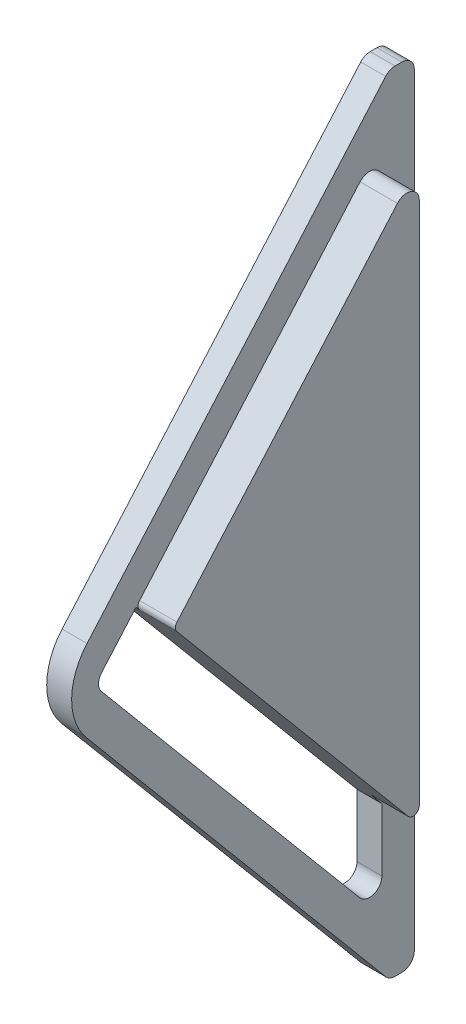
ISO-10303-21;
HEADER;
FILE_DESCRIPTION(('STEP AP214'),'2;1');
FILE_NAME('part.step','',(''),(''),'','','');
FILE_SCHEMA(('AUTOMOTIVE_DESIGN { 1 0 10303 214 1 1 1 1 }'));
ENDSEC;
DATA;
#1=APPLICATION_CONTEXT('core data for automotive mechanical design processes');
#2=APPLICATION_PROTOCOL_DEFINITION('international standard','automotive_design',2000,#1);
#3=PRODUCT_CONTEXT('',#1,'mechanical');
#4=PRODUCT('Part','Part','',(#3));
#5=PRODUCT_RELATED_PRODUCT_CATEGORY('part','',(#4));
#6=PRODUCT_DEFINITION_FORMATION('','',#4);
#7=PRODUCT_DEFINITION_CONTEXT('part definition',#1,'design');
#8=PRODUCT_DEFINITION('design','',#6,#7);
#9=PRODUCT_DEFINITION_SHAPE('','',#8);
#10=(LENGTH_UNIT() NAMED_UNIT(*) SI_UNIT(.MILLI.,.METRE.));
#11=(NAMED_UNIT(*) PLANE_ANGLE_UNIT() SI_UNIT($,.RADIAN.));
#12=(NAMED_UNIT(*) SI_UNIT($,.STERADIAN.) SOLID_ANGLE_UNIT());
#13=UNCERTAINTY_MEASURE_WITH_UNIT(LENGTH_MEASURE(1.E-05),#10,'distance_accuracy_value','');
#14=(GEOMETRIC_REPRESENTATION_CONTEXT(3) GLOBAL_UNCERTAINTY_ASSIGNED_CONTEXT((#13)) GLOBAL_UNIT_ASSIGNED_CONTEXT((#10,
#11,#12)) REPRESENTATION_CONTEXT('',''));
#15=CARTESIAN_POINT('',(0.,0.,0.));
#16=DIRECTION('',(0.,0.,1.));
#17=DIRECTION('',(1.,0.,0.));
#18=AXIS2_PLACEMENT_3D('',#15,#16,#17);
#19=CARTESIAN_POINT('',(15.819939298706,22.7196326731635,20.4241240625662));
#20=DIRECTION('',(0.,0.657969745780061,0.753044363658691));
#21=DIRECTION('',(0.,-0.753044363658691,0.657969745780061));
#22=AXIS2_PLACEMENT_3D('',#19,#20,#21);
#23=PLANE('',#22);
#24=DIRECTION('',(0.,0.753044363658691,-0.657969745780061));
#25=VECTOR('',#24,1.);
#26=CARTESIAN_POINT('',(17.819939298706,22.7196326731635,20.4241240625662));
#27=LINE('',#26,#25);
#28=CARTESIAN_POINT('',(17.819939298706,33.4137483442441,11.0801797891415));
#29=VERTEX_POINT('',#28);
#30=CARTESIAN_POINT('',(17.819939298706,53.6703099449129,-6.61891647925724));
#31=VERTEX_POINT('',#30);
#32=EDGE_CURVE('E280',#29,#31,#27,.T.);
#33=ORIENTED_EDGE('',*,*,#32,.F.);
#34=DIRECTION('',(-1.,0.,0.));
#35=VECTOR('',#34,1.);
#36=CARTESIAN_POINT('',(20.819939298706,33.4137483442441,11.0801797891415));
#37=LINE('',#36,#35);
#38=CARTESIAN_POINT('',(20.819939298706,33.4137483442441,11.0801797891415));
#39=VERTEX_POINT('',#38);
#40=EDGE_CURVE('E415',#29,#39,#37,.F.);
#41=ORIENTED_EDGE('',*,*,#40,.T.);
#42=DIRECTION('',(0.,-0.753044363658691,0.657969745780061));
#43=VECTOR('',#42,1.);
#44=CARTESIAN_POINT('',(20.819939298706,22.7196326731635,20.4241240625662));
#45=LINE('',#44,#43);
#46=CARTESIAN_POINT('',(20.819939298706,53.6703099449129,-6.61891647925724));
#47=VERTEX_POINT('',#46);
#48=EDGE_CURVE('E307',#47,#39,#45,.T.);
#49=ORIENTED_EDGE('',*,*,#48,.F.);
#50=DIRECTION('',(1.,0.,0.));
#51=VECTOR('',#50,1.);
#52=CARTESIAN_POINT('',(15.819939298706,53.6703099449129,-6.61891647925724));
#53=LINE('',#52,#51);
#54=EDGE_CURVE('E337',#47,#31,#53,.F.);
#55=ORIENTED_EDGE('',*,*,#54,.T.);
#56=EDGE_LOOP('',(#33,#41,#49,#55));
#57=FACE_BOUND('',#56,.T.);
#58=ADVANCED_FACE('F47',(#57),#23,.T.);
#59=CARTESIAN_POINT('',(15.819939298706,-2.9650885007879,-8.37196084291593));
#60=DIRECTION('',(0.,0.,-1.));
#61=DIRECTION('',(-1.,0.,0.));
#62=AXIS2_PLACEMENT_3D('',#59,#60,#61);
#63=PLANE('',#62);
#64=DIRECTION('',(0.,1.,0.));
#65=VECTOR('',#64,1.);
#66=CARTESIAN_POINT('',(20.819939298706,-2.9650885007879,-8.37196084291593));
#67=LINE('',#66,#65);
#68=CARTESIAN_POINT('',(20.819939298706,10.9472034486352,-8.37196084291593));
#69=VERTEX_POINT('',#68);
#70=CARTESIAN_POINT('',(20.819939298706,53.0123401991329,-8.37196084291593));
#71=VERTEX_POINT('',#70);
#72=EDGE_CURVE('E304',#69,#71,#67,.T.);
#73=ORIENTED_EDGE('',*,*,#72,.F.);
#74=DIRECTION('',(-1.,0.,0.));
#75=VECTOR('',#74,1.);
#76=CARTESIAN_POINT('',(17.819939298706,10.9472034486352,-8.37196084291593));
#77=LINE('',#76,#75);
#78=CARTESIAN_POINT('',(17.819939298706,10.9472034486352,-8.37196084291593));
#79=VERTEX_POINT('',#78);
#80=EDGE_CURVE('E424',#69,#79,#77,.T.);
#81=ORIENTED_EDGE('',*,*,#80,.T.);
#82=DIRECTION('',(0.,-1.,0.));
#83=VECTOR('',#82,1.);
#84=CARTESIAN_POINT('',(17.819939298706,-2.9650885007879,-8.37196084291593));
#85=LINE('',#84,#83);
#86=CARTESIAN_POINT('',(17.819939298706,53.0123401991329,-8.37196084291593));
#87=VERTEX_POINT('',#86);
#88=EDGE_CURVE('E311',#87,#79,#85,.T.);
#89=ORIENTED_EDGE('',*,*,#88,.F.);
#90=DIRECTION('',(1.,0.,0.));
#91=VECTOR('',#90,1.);
#92=CARTESIAN_POINT('',(15.819939298706,53.0123401991329,-8.37196084291593));
#93=LINE('',#92,#91);
#94=EDGE_CURVE('E333',#87,#71,#93,.T.);
#95=ORIENTED_EDGE('',*,*,#94,.T.);
#96=EDGE_LOOP('',(#73,#81,#89,#95));
#97=FACE_BOUND('',#96,.T.);
#98=ADVANCED_FACE('F463',(#97),#63,.T.);
#99=CARTESIAN_POINT('',(20.819939298706,-2.9650885007879,-8.97196084291592));
#100=DIRECTION('',(1.,0.,0.));
#101=DIRECTION('',(0.,0.,-1.));
#102=AXIS2_PLACEMENT_3D('',#99,#100,#101);
#103=PLANE('',#102);
#104=ORIENTED_EDGE('',*,*,#48,.T.);
#105=CARTESIAN_POINT('',(20.819939298706,33.084763471354,10.7036576073121));
#106=DIRECTION('',(1.,0.,0.));
#107=DIRECTION('',(0.,0.,-1.));
#108=AXIS2_PLACEMENT_3D('',#105,#106,#107);
#109=CIRCLE('',#108,0.5);
#110=CARTESIAN_POINT('',(20.819939298706,32.7633696665108,11.0866798288716));
#111=VERTEX_POINT('',#110);
#112=EDGE_CURVE('E421',#39,#111,#109,.T.);
#113=ORIENTED_EDGE('',*,*,#112,.T.);
#114=DIRECTION('',(0.,-0.766044443118982,-0.642787609686535));
#115=VECTOR('',#114,1.);
#116=CARTESIAN_POINT('',(20.819939298706,8.07791098952799,-9.62687944242635));
#117=LINE('',#116,#115);
#118=CARTESIAN_POINT('',(20.819939298706,10.6258096437919,-7.48893862135644));
#119=VERTEX_POINT('',#118);
#120=EDGE_CURVE('E241',#111,#119,#117,.T.);
#121=ORIENTED_EDGE('',*,*,#120,.T.);
#122=CARTESIAN_POINT('',(20.819939298706,10.9472034486352,-7.87196084291593));
#123=DIRECTION('',(1.,0.,0.));
#124=DIRECTION('',(0.,0.,-1.));
#125=AXIS2_PLACEMENT_3D('',#122,#123,#124);
#126=CIRCLE('',#125,0.5);
#127=EDGE_CURVE('E418',#119,#69,#126,.T.);
#128=ORIENTED_EDGE('',*,*,#127,.T.);
#129=ORIENTED_EDGE('',*,*,#72,.T.);
#130=CARTESIAN_POINT('',(20.819939298706,53.0123401991329,-7.37196084291593));
#131=DIRECTION('',(1.,0.,0.));
#132=DIRECTION('',(0.,0.,-1.));
#133=AXIS2_PLACEMENT_3D('',#130,#131,#132);
#134=CIRCLE('',#133,1.);
#135=EDGE_CURVE('E330',#71,#47,#134,.T.);
#136=ORIENTED_EDGE('',*,*,#135,.T.);
#137=EDGE_LOOP('',(#104,#113,#121,#128,#129,#136));
#138=FACE_BOUND('',#137,.T.);
#139=ADVANCED_FACE('F444',(#138),#103,.T.);
#140=CARTESIAN_POINT('',(17.819939298706,60.3149114992121,-8.97196084291592));
#141=DIRECTION('',(0.,1.,0.));
#142=DIRECTION('',(0.,0.,1.));
#143=AXIS2_PLACEMENT_3D('',#140,#141,#142);
#144=PLANE('',#143);
#145=DIRECTION('',(0.,0.,-1.));
#146=VECTOR('',#145,1.);
#147=CARTESIAN_POINT('',(15.819939298706,60.3149114992121,-8.97196084291592));
#148=LINE('',#147,#146);
#149=CARTESIAN_POINT('',(15.819939298706,60.3149114992121,-9.42615752869706));
#150=VERTEX_POINT('',#149);
#151=CARTESIAN_POINT('',(15.819939298706,60.3149114992121,-9.97196084291593));
#152=VERTEX_POINT('',#151);
#153=EDGE_CURVE('E259',#150,#152,#148,.T.);
#154=ORIENTED_EDGE('',*,*,#153,.F.);
#155=DIRECTION('',(-1.,0.,0.));
#156=VECTOR('',#155,1.);
#157=CARTESIAN_POINT('',(17.819939298706,60.3149114992121,-9.42615752869706));
#158=LINE('',#157,#156);
#159=CARTESIAN_POINT('',(17.819939298706,60.3149114992121,-9.42615752869706));
#160=VERTEX_POINT('',#159);
#161=EDGE_CURVE('E400',#150,#160,#158,.F.);
#162=ORIENTED_EDGE('',*,*,#161,.T.);
#163=DIRECTION('',(0.,0.,-1.));
#164=VECTOR('',#163,1.);
#165=CARTESIAN_POINT('',(17.819939298706,60.3149114992121,-8.97196084291592));
#166=LINE('',#165,#164);
#167=CARTESIAN_POINT('',(17.819939298706,60.3149114992121,-9.97196084291593));
#168=VERTEX_POINT('',#167);
#169=EDGE_CURVE('E260',#160,#168,#166,.T.);
#170=ORIENTED_EDGE('',*,*,#169,.T.);
#171=DIRECTION('',(-1.,0.,0.));
#172=VECTOR('',#171,1.);
#173=CARTESIAN_POINT('',(15.819939298706,60.3149114992121,-9.97196084291593));
#174=LINE('',#173,#172);
#175=EDGE_CURVE('E396',#168,#152,#174,.T.);
#176=ORIENTED_EDGE('',*,*,#175,.T.);
#177=EDGE_LOOP('',(#154,#162,#170,#176));
#178=FACE_BOUND('',#177,.T.);
#179=ADVANCED_FACE('F491',(#178),#144,.T.);
#180=CARTESIAN_POINT('',(17.819939298706,24.4303540121917,22.3820394080788));
#181=DIRECTION('',(0.,-0.657969745780061,-0.753044363658691));
#182=DIRECTION('',(0.,0.753044363658691,-0.657969745780061));
#183=AXIS2_PLACEMENT_3D('',#180,#181,#182);
#184=PLANE('',#183);
#185=DIRECTION('',(0.,-0.753044363658691,0.657969745780061));
#186=VECTOR('',#185,1.);
#187=CARTESIAN_POINT('',(17.819939298706,24.4303540121917,22.3820394080788));
#188=LINE('',#187,#186);
#189=CARTESIAN_POINT('',(17.819939298706,59.9728812449922,-8.67311316503838));
#190=VERTEX_POINT('',#189);
#191=CARTESIAN_POINT('',(17.819939298706,32.5389757891054,15.2971609246105));
#192=VERTEX_POINT('',#191);
#193=EDGE_CURVE('E277',#190,#192,#188,.T.);
#194=ORIENTED_EDGE('',*,*,#193,.F.);
#195=DIRECTION('',(-1.,0.,0.));
#196=VECTOR('',#195,1.);
#197=CARTESIAN_POINT('',(15.819939298706,59.9728812449922,-8.67311316503837));
#198=LINE('',#197,#196);
#199=CARTESIAN_POINT('',(15.819939298706,59.9728812449922,-8.67311316503838));
#200=VERTEX_POINT('',#199);
#201=EDGE_CURVE('E392',#190,#200,#198,.T.);
#202=ORIENTED_EDGE('',*,*,#201,.T.);
#203=DIRECTION('',(0.,-0.753044363658691,0.657969745780061));
#204=VECTOR('',#203,1.);
#205=CARTESIAN_POINT('',(15.819939298706,24.4303540121917,22.3820394080788));
#206=LINE('',#205,#204);
#207=CARTESIAN_POINT('',(15.819939298706,32.5389757891054,15.2971609246105));
#208=VERTEX_POINT('',#207);
#209=EDGE_CURVE('E265',#200,#208,#206,.T.);
#210=ORIENTED_EDGE('',*,*,#209,.T.);
#211=DIRECTION('',(-1.,0.,0.));
#212=VECTOR('',#211,1.);
#213=CARTESIAN_POINT('',(17.819939298706,32.5389757891054,15.2971609246105));
#214=LINE('',#213,#212);
#215=EDGE_CURVE('E323',#208,#192,#214,.F.);
#216=ORIENTED_EDGE('',*,*,#215,.T.);
#217=EDGE_LOOP('',(#194,#202,#210,#216));
#218=FACE_BOUND('',#217,.T.);
#219=ADVANCED_FACE('F496',(#218),#184,.F.);
#220=CARTESIAN_POINT('',(17.819939298706,-2.9650885007879,-8.97196084291592));
#221=DIRECTION('',(0.,0.642787609686535,-0.766044443118982));
#222=DIRECTION('',(0.,0.766044443118982,0.642787609686535));
#223=AXIS2_PLACEMENT_3D('',#220,#221,#222);
#224=PLANE('',#223);
#225=DIRECTION('',(0.,-0.766044443118982,-0.642787609686535));
#226=VECTOR('',#225,1.);
#227=CARTESIAN_POINT('',(15.819939298706,-2.9650885007879,-8.97196084291592));
#228=LINE('',#227,#226);
#229=CARTESIAN_POINT('',(15.819939298706,26.0351890117724,15.3621613219119));
#230=VERTEX_POINT('',#229);
#231=CARTESIAN_POINT('',(15.819939298706,-2.60787611047445,-8.67222405795195));
#232=VERTEX_POINT('',#231);
#233=EDGE_CURVE('E292',#230,#232,#228,.T.);
#234=ORIENTED_EDGE('',*,*,#233,.T.);
#235=DIRECTION('',(-1.,0.,0.));
#236=VECTOR('',#235,1.);
#237=CARTESIAN_POINT('',(17.819939298706,-2.60787611047445,-8.67222405795195));
#238=LINE('',#237,#236);
#239=CARTESIAN_POINT('',(17.819939298706,-2.60787611047445,-8.67222405795195));
#240=VERTEX_POINT('',#239);
#241=EDGE_CURVE('E370',#232,#240,#238,.F.);
#242=ORIENTED_EDGE('',*,*,#241,.T.);
#243=DIRECTION('',(0.,-0.766044443118982,-0.642787609686535));
#244=VECTOR('',#243,1.);
#245=CARTESIAN_POINT('',(17.819939298706,-2.9650885007879,-8.97196084291592));
#246=LINE('',#245,#244);
#247=CARTESIAN_POINT('',(17.819939298706,26.0351890117724,15.3621613219119));
#248=VERTEX_POINT('',#247);
#249=EDGE_CURVE('E273',#248,#240,#246,.T.);
#250=ORIENTED_EDGE('',*,*,#249,.F.);
#251=DIRECTION('',(-1.,0.,0.));
#252=VECTOR('',#251,1.);
#253=CARTESIAN_POINT('',(17.819939298706,26.0351890117724,15.3621613219119));
#254=LINE('',#253,#252);
#255=EDGE_CURVE('E315',#248,#230,#254,.T.);
#256=ORIENTED_EDGE('',*,*,#255,.T.);
#257=EDGE_LOOP('',(#234,#242,#250,#256));
#258=FACE_BOUND('',#257,.T.);
#259=ADVANCED_FACE('F505',(#258),#224,.F.);
#260=CARTESIAN_POINT('',(17.819939298706,-2.96508850078792,-8.97196084291592));
#261=DIRECTION('',(0.,1.,0.));
#262=DIRECTION('',(0.,0.,1.));
#263=AXIS2_PLACEMENT_3D('',#260,#261,#262);
#264=PLANE('',#263);
#265=DIRECTION('',(0.,0.,-1.));
#266=VECTOR('',#265,1.);
#267=CARTESIAN_POINT('',(17.819939298706,-2.96508850078792,-8.97196084291592));
#268=LINE('',#267,#266);
#269=CARTESIAN_POINT('',(17.819939298706,-2.96508850078791,-9.43826850107094));
#270=VERTEX_POINT('',#269);
#271=CARTESIAN_POINT('',(17.819939298706,-2.96508850078791,-9.97196084291593));
#272=VERTEX_POINT('',#271);
#273=EDGE_CURVE('E269',#270,#272,#268,.T.);
#274=ORIENTED_EDGE('',*,*,#273,.F.);
#275=DIRECTION('',(-1.,0.,0.));
#276=VECTOR('',#275,1.);
#277=CARTESIAN_POINT('',(17.819939298706,-2.96508850078791,-9.43826850107094));
#278=LINE('',#277,#276);
#279=CARTESIAN_POINT('',(15.819939298706,-2.96508850078791,-9.43826850107094));
#280=VERTEX_POINT('',#279);
#281=EDGE_CURVE('E354',#270,#280,#278,.T.);
#282=ORIENTED_EDGE('',*,*,#281,.T.);
#283=DIRECTION('',(0.,0.,-1.));
#284=VECTOR('',#283,1.);
#285=CARTESIAN_POINT('',(15.819939298706,-2.96508850078792,-8.97196084291592));
#286=LINE('',#285,#284);
#287=CARTESIAN_POINT('',(15.819939298706,-2.96508850078791,-9.97196084291593));
#288=VERTEX_POINT('',#287);
#289=EDGE_CURVE('E288',#280,#288,#286,.T.);
#290=ORIENTED_EDGE('',*,*,#289,.T.);
#291=DIRECTION('',(-1.,0.,0.));
#292=VECTOR('',#291,1.);
#293=CARTESIAN_POINT('',(17.819939298706,-2.96508850078791,-9.97196084291593));
#294=LINE('',#293,#292);
#295=EDGE_CURVE('E351',#288,#272,#294,.F.);
#296=ORIENTED_EDGE('',*,*,#295,.T.);
#297=EDGE_LOOP('',(#274,#282,#290,#296));
#298=FACE_BOUND('',#297,.T.);
#299=ADVANCED_FACE('F501',(#298),#264,.F.);
#300=CARTESIAN_POINT('',(17.819939298706,-2.9650885007879,-10.9719608429159));
#301=DIRECTION('',(0.,0.,1.));
#302=DIRECTION('',(1.,0.,0.));
#303=AXIS2_PLACEMENT_3D('',#300,#301,#302);
#304=PLANE('',#303);
#305=DIRECTION('',(0.,1.,0.));
#306=VECTOR('',#305,1.);
#307=CARTESIAN_POINT('',(17.819939298706,-2.9650885007879,-10.9719608429159));
#308=LINE('',#307,#306);
#309=CARTESIAN_POINT('',(17.819939298706,-1.96508850078791,-10.9719608429159));
#310=VERTEX_POINT('',#309);
#311=CARTESIAN_POINT('',(17.819939298706,59.3149114992121,-10.9719608429159));
#312=VERTEX_POINT('',#311);
#313=EDGE_CURVE('E264',#310,#312,#308,.T.);
#314=ORIENTED_EDGE('',*,*,#313,.F.);
#315=DIRECTION('',(-1.,0.,0.));
#316=VECTOR('',#315,1.);
#317=CARTESIAN_POINT('',(17.819939298706,-1.96508850078791,-10.9719608429159));
#318=LINE('',#317,#316);
#319=CARTESIAN_POINT('',(15.819939298706,-1.96508850078791,-10.9719608429159));
#320=VERTEX_POINT('',#319);
#321=EDGE_CURVE('E388',#310,#320,#318,.T.);
#322=ORIENTED_EDGE('',*,*,#321,.T.);
#323=DIRECTION('',(0.,1.,0.));
#324=VECTOR('',#323,1.);
#325=CARTESIAN_POINT('',(15.819939298706,-2.9650885007879,-10.9719608429159));
#326=LINE('',#325,#324);
#327=CARTESIAN_POINT('',(15.819939298706,59.3149114992121,-10.9719608429159));
#328=VERTEX_POINT('',#327);
#329=EDGE_CURVE('E284',#320,#328,#326,.T.);
#330=ORIENTED_EDGE('',*,*,#329,.T.);
#331=DIRECTION('',(-1.,0.,0.));
#332=VECTOR('',#331,1.);
#333=CARTESIAN_POINT('',(17.819939298706,59.3149114992121,-10.9719608429159));
#334=LINE('',#333,#332);
#335=EDGE_CURVE('E385',#328,#312,#334,.F.);
#336=ORIENTED_EDGE('',*,*,#335,.T.);
#337=EDGE_LOOP('',(#314,#322,#330,#336));
#338=FACE_BOUND('',#337,.T.);
#339=ADVANCED_FACE('F498',(#338),#304,.F.);
#340=CARTESIAN_POINT('',(17.819939298706,-2.9650885007879,-8.97196084291592));
#341=DIRECTION('',(1.,0.,0.));
#342=DIRECTION('',(0.,0.,-1.));
#343=AXIS2_PLACEMENT_3D('',#340,#341,#342);
#344=PLANE('',#343);
#345=CARTESIAN_POINT('',(17.819939298706,29.9255164489071,14.1280095906231));
#346=VERTEX_POINT('',#345);
#347=CARTESIAN_POINT('',(17.819939298706,33.0913419152547,11.3618812218291));
#348=VERTEX_POINT('',#347);
#349=EDGE_CURVE('E205',#346,#348,#27,.T.);
#350=ORIENTED_EDGE('',*,*,#349,.T.);
#351=DIRECTION('',(0.,0.766044443118982,0.642787609686535));
#352=VECTOR('',#351,1.);
#353=CARTESIAN_POINT('',(17.819939298706,1.92009733282976,-14.7938986106202));
#354=LINE('',#353,#352);
#355=CARTESIAN_POINT('',(17.819939298706,32.7633696665108,11.0866798288716));
#356=VERTEX_POINT('',#355);
#357=EDGE_CURVE('E408',#356,#348,#354,.T.);
#358=ORIENTED_EDGE('',*,*,#357,.F.);
#359=CARTESIAN_POINT('',(17.819939298706,33.084763471354,10.7036576073121));
#360=DIRECTION('',(1.,0.,0.));
#361=DIRECTION('',(0.,0.,-1.));
#362=AXIS2_PLACEMENT_3D('',#359,#360,#361);
#363=CIRCLE('',#362,0.5);
#364=EDGE_CURVE('E56',#356,#29,#363,.F.);
#365=ORIENTED_EDGE('',*,*,#364,.T.);
#366=ORIENTED_EDGE('',*,*,#32,.T.);
#367=CARTESIAN_POINT('',(17.819939298706,53.0123401991329,-7.37196084291593));
#368=DIRECTION('',(1.,0.,0.));
#369=DIRECTION('',(0.,0.,-1.));
#370=AXIS2_PLACEMENT_3D('',#367,#368,#369);
#371=CIRCLE('',#370,1.);
#372=EDGE_CURVE('E345',#31,#87,#371,.F.);
#373=ORIENTED_EDGE('',*,*,#372,.T.);
#374=ORIENTED_EDGE('',*,*,#88,.T.);
#375=CARTESIAN_POINT('',(17.819939298706,10.9472034486352,-7.87196084291593));
#376=DIRECTION('',(1.,0.,0.));
#377=DIRECTION('',(0.,0.,-1.));
#378=AXIS2_PLACEMENT_3D('',#375,#376,#377);
#379=CIRCLE('',#378,0.5);
#380=CARTESIAN_POINT('',(17.819939298706,10.6258096437919,-7.48893862135643));
#381=VERTEX_POINT('',#380);
#382=EDGE_CURVE('E11',#79,#381,#379,.F.);
#383=ORIENTED_EDGE('',*,*,#382,.T.);
#384=DIRECTION('',(0.,0.766044443118982,0.642787609686535));
#385=VECTOR('',#384,1.);
#386=CARTESIAN_POINT('',(17.819939298706,1.92009733282976,-14.7938986106202));
#387=LINE('',#386,#385);
#388=CARTESIAN_POINT('',(17.819939298706,9.57346473890784,-8.37196084291593));
#389=VERTEX_POINT('',#388);
#390=EDGE_CURVE('E62',#389,#381,#387,.T.);
#391=ORIENTED_EDGE('',*,*,#390,.F.);
#392=DIRECTION('',(0.,1.,0.));
#393=VECTOR('',#392,1.);
#394=CARTESIAN_POINT('',(17.819939298706,-2.9650885007879,-8.37196084291593));
#395=LINE('',#394,#393);
#396=CARTESIAN_POINT('',(17.819939298706,4.54232302406038,-8.37196084291593));
#397=VERTEX_POINT('',#396);
#398=EDGE_CURVE('E245',#397,#389,#395,.T.);
#399=ORIENTED_EDGE('',*,*,#398,.F.);
#400=CARTESIAN_POINT('',(17.819939298706,4.54232302406038,-7.37196084291593));
#401=DIRECTION('',(1.,0.,0.));
#402=DIRECTION('',(0.,0.,-1.));
#403=AXIS2_PLACEMENT_3D('',#400,#401,#402);
#404=CIRCLE('',#403,1.);
#405=CARTESIAN_POINT('',(17.819939298706,3.89953541437384,-6.60591639979694));
#406=VERTEX_POINT('',#405);
#407=EDGE_CURVE('E341',#397,#406,#404,.F.);
#408=ORIENTED_EDGE('',*,*,#407,.T.);
#409=DIRECTION('',(0.,0.766044443118982,0.642787609686535));
#410=VECTOR('',#409,1.);
#411=CARTESIAN_POINT('',(17.819939298706,-1.29384071560291,-10.9636763950253));
#412=LINE('',#411,#410);
#413=CARTESIAN_POINT('',(17.819939298706,28.6247590934405,14.1410096700834));
#414=VERTEX_POINT('',#413);
#415=EDGE_CURVE('E300',#406,#414,#412,.T.);
#416=ORIENTED_EDGE('',*,*,#415,.T.);
#417=CARTESIAN_POINT('',(17.819939298706,29.2675467031271,13.3749652269644));
#418=DIRECTION('',(1.,0.,0.));
#419=DIRECTION('',(0.,0.,-1.));
#420=AXIS2_PLACEMENT_3D('',#417,#418,#419);
#421=CIRCLE('',#420,1.);
#422=EDGE_CURVE('E348',#414,#346,#421,.F.);
#423=ORIENTED_EDGE('',*,*,#422,.T.);
#424=EDGE_LOOP('',(#350,#358,#365,#366,#373,#374,#383,#391,#399,#408,#416,#423));
#425=FACE_BOUND('',#424,.T.);
#426=ORIENTED_EDGE('',*,*,#249,.T.);
#427=CARTESIAN_POINT('',(17.819939298706,-1.96508850078791,-9.43826850107093));
#428=DIRECTION('',(1.,0.,0.));
#429=DIRECTION('',(0.,0.,-1.));
#430=AXIS2_PLACEMENT_3D('',#427,#428,#429);
#431=CIRCLE('',#430,1.);
#432=EDGE_CURVE('E382',#240,#270,#431,.T.);
#433=ORIENTED_EDGE('',*,*,#432,.T.);
#434=ORIENTED_EDGE('',*,*,#273,.T.);
#435=CARTESIAN_POINT('',(17.819939298706,-1.96508850078791,-9.97196084291593));
#436=DIRECTION('',(1.,0.,0.));
#437=DIRECTION('',(0.,0.,-1.));
#438=AXIS2_PLACEMENT_3D('',#435,#436,#437);
#439=CIRCLE('',#438,1.);
#440=EDGE_CURVE('E379',#272,#310,#439,.T.);
#441=ORIENTED_EDGE('',*,*,#440,.T.);
#442=ORIENTED_EDGE('',*,*,#313,.T.);
#443=CARTESIAN_POINT('',(17.819939298706,59.3149114992121,-9.97196084291593));
#444=DIRECTION('',(1.,0.,0.));
#445=DIRECTION('',(0.,0.,-1.));
#446=AXIS2_PLACEMENT_3D('',#443,#444,#445);
#447=CIRCLE('',#446,1.);
#448=EDGE_CURVE('E373',#312,#168,#447,.T.);
#449=ORIENTED_EDGE('',*,*,#448,.T.);
#450=ORIENTED_EDGE('',*,*,#169,.F.);
#451=CARTESIAN_POINT('',(17.819939298706,59.3149114992121,-9.42615752869706));
#452=DIRECTION('',(1.,0.,0.));
#453=DIRECTION('',(0.,0.,-1.));
#454=AXIS2_PLACEMENT_3D('',#451,#452,#453);
#455=CIRCLE('',#454,1.);
#456=EDGE_CURVE('E376',#160,#190,#455,.T.);
#457=ORIENTED_EDGE('',*,*,#456,.T.);
#458=ORIENTED_EDGE('',*,*,#193,.T.);
#459=CARTESIAN_POINT('',(17.819939298706,29.2491270602051,11.531939106317));
#460=DIRECTION('',(1.,0.,0.));
#461=DIRECTION('',(0.,0.,-1.));
#462=AXIS2_PLACEMENT_3D('',#459,#460,#461);
#463=CIRCLE('',#462,5.);
#464=EDGE_CURVE('E327',#192,#248,#463,.T.);
#465=ORIENTED_EDGE('',*,*,#464,.T.);
#466=EDGE_LOOP('',(#426,#433,#434,#441,#442,#449,#450,#457,#458,#465));
#467=FACE_BOUND('',#466,.T.);
#468=ADVANCED_FACE('F429',(#425,#467),#344,.T.);
#469=CARTESIAN_POINT('',(15.819939298706,-2.9650885007879,-8.97196084291592));
#470=DIRECTION('',(1.,0.,0.));
#471=DIRECTION('',(0.,0.,-1.));
#472=AXIS2_PLACEMENT_3D('',#469,#470,#471);
#473=PLANE('',#472);
#474=CARTESIAN_POINT('',(15.819939298706,29.2675467031271,13.3749652269644));
#475=DIRECTION('',(-1.,0.,0.));
#476=DIRECTION('',(0.,0.,1.));
#477=AXIS2_PLACEMENT_3D('',#474,#475,#476);
#478=CIRCLE('',#477,1.);
#479=CARTESIAN_POINT('',(15.819939298706,28.6247590934405,14.1410096700834));
#480=VERTEX_POINT('',#479);
#481=CARTESIAN_POINT('',(15.819939298706,29.9255164489071,14.1280095906231));
#482=VERTEX_POINT('',#481);
#483=EDGE_CURVE('E214',#480,#482,#478,.T.);
#484=ORIENTED_EDGE('',*,*,#483,.F.);
#485=DIRECTION('',(0.,0.766044443118982,0.642787609686535));
#486=VECTOR('',#485,1.);
#487=CARTESIAN_POINT('',(15.819939298706,4.86397294109532,-5.79665722683144));
#488=LINE('',#487,#486);
#489=CARTESIAN_POINT('',(15.819939298706,3.89953541437384,-6.60591639979694));
#490=VERTEX_POINT('',#489);
#491=EDGE_CURVE('E220',#490,#480,#488,.T.);
#492=ORIENTED_EDGE('',*,*,#491,.F.);
#493=CARTESIAN_POINT('',(15.819939298706,4.54232302406038,-7.37196084291593));
#494=DIRECTION('',(-1.,0.,0.));
#495=DIRECTION('',(0.,0.,1.));
#496=AXIS2_PLACEMENT_3D('',#493,#494,#495);
#497=CIRCLE('',#496,1.);
#498=CARTESIAN_POINT('',(15.819939298706,4.54232302406038,-8.37196084291593));
#499=VERTEX_POINT('',#498);
#500=EDGE_CURVE('E237',#499,#490,#497,.T.);
#501=ORIENTED_EDGE('',*,*,#500,.F.);
#502=DIRECTION('',(0.,-1.,0.));
#503=VECTOR('',#502,1.);
#504=CARTESIAN_POINT('',(15.819939298706,0.,-8.37196084291593));
#505=LINE('',#504,#503);
#506=CARTESIAN_POINT('',(15.819939298706,9.57346473890784,-8.37196084291593));
#507=VERTEX_POINT('',#506);
#508=EDGE_CURVE('E230',#507,#499,#505,.T.);
#509=ORIENTED_EDGE('',*,*,#508,.F.);
#510=DIRECTION('',(0.,-0.766044443118982,-0.642787609686535));
#511=VECTOR('',#510,1.);
#512=CARTESIAN_POINT('',(15.819939298706,8.07791098952799,-9.62687944242635));
#513=LINE('',#512,#511);
#514=CARTESIAN_POINT('',(15.819939298706,33.0913419152547,11.3618812218291));
#515=VERTEX_POINT('',#514);
#516=EDGE_CURVE('E226',#515,#507,#513,.T.);
#517=ORIENTED_EDGE('',*,*,#516,.F.);
#518=DIRECTION('',(0.,0.753044363658691,-0.65796974578006));
#519=VECTOR('',#518,1.);
#520=CARTESIAN_POINT('',(15.819939298706,19.9556318236049,22.839159648895));
#521=LINE('',#520,#519);
#522=EDGE_CURVE('E202',#482,#515,#521,.T.);
#523=ORIENTED_EDGE('',*,*,#522,.F.);
#524=EDGE_LOOP('',(#484,#492,#501,#509,#517,#523));
#525=FACE_BOUND('',#524,.T.);
#526=ORIENTED_EDGE('',*,*,#289,.F.);
#527=CARTESIAN_POINT('',(15.819939298706,-1.96508850078791,-9.43826850107093));
#528=DIRECTION('',(1.,0.,0.));
#529=DIRECTION('',(0.,0.,-1.));
#530=AXIS2_PLACEMENT_3D('',#527,#528,#529);
#531=CIRCLE('',#530,1.);
#532=EDGE_CURVE('E367',#280,#232,#531,.F.);
#533=ORIENTED_EDGE('',*,*,#532,.T.);
#534=ORIENTED_EDGE('',*,*,#233,.F.);
#535=CARTESIAN_POINT('',(15.819939298706,29.2491270602051,11.531939106317));
#536=DIRECTION('',(1.,0.,0.));
#537=DIRECTION('',(0.,0.,-1.));
#538=AXIS2_PLACEMENT_3D('',#535,#536,#537);
#539=CIRCLE('',#538,5.);
#540=EDGE_CURVE('E319',#230,#208,#539,.F.);
#541=ORIENTED_EDGE('',*,*,#540,.T.);
#542=ORIENTED_EDGE('',*,*,#209,.F.);
#543=CARTESIAN_POINT('',(15.819939298706,59.3149114992121,-9.42615752869706));
#544=DIRECTION('',(1.,0.,0.));
#545=DIRECTION('',(0.,0.,-1.));
#546=AXIS2_PLACEMENT_3D('',#543,#544,#545);
#547=CIRCLE('',#546,1.);
#548=EDGE_CURVE('E361',#200,#150,#547,.F.);
#549=ORIENTED_EDGE('',*,*,#548,.T.);
#550=ORIENTED_EDGE('',*,*,#153,.T.);
#551=CARTESIAN_POINT('',(15.819939298706,59.3149114992121,-9.97196084291593));
#552=DIRECTION('',(1.,0.,0.));
#553=DIRECTION('',(0.,0.,-1.));
#554=AXIS2_PLACEMENT_3D('',#551,#552,#553);
#555=CIRCLE('',#554,1.);
#556=EDGE_CURVE('E358',#152,#328,#555,.F.);
#557=ORIENTED_EDGE('',*,*,#556,.T.);
#558=ORIENTED_EDGE('',*,*,#329,.F.);
#559=CARTESIAN_POINT('',(15.819939298706,-1.96508850078791,-9.97196084291593));
#560=DIRECTION('',(1.,0.,0.));
#561=DIRECTION('',(0.,0.,-1.));
#562=AXIS2_PLACEMENT_3D('',#559,#560,#561);
#563=CIRCLE('',#562,1.);
#564=EDGE_CURVE('E364',#320,#288,#563,.F.);
#565=ORIENTED_EDGE('',*,*,#564,.T.);
#566=EDGE_LOOP('',(#526,#533,#534,#541,#542,#549,#550,#557,#558,#565));
#567=FACE_BOUND('',#566,.T.);
#568=ADVANCED_FACE('F222',(#525,#567),#473,.F.);
#569=CARTESIAN_POINT('',(17.819939298706,29.2491270602051,11.531939106317));
#570=DIRECTION('',(-1.,0.,0.));
#571=DIRECTION('',(0.,0.,1.));
#572=AXIS2_PLACEMENT_3D('',#569,#570,#571);
#573=CYLINDRICAL_SURFACE('',#572,5.);
#574=ORIENTED_EDGE('',*,*,#464,.F.);
#575=ORIENTED_EDGE('',*,*,#215,.F.);
#576=ORIENTED_EDGE('',*,*,#540,.F.);
#577=ORIENTED_EDGE('',*,*,#255,.F.);
#578=EDGE_LOOP('',(#574,#575,#576,#577));
#579=FACE_BOUND('',#578,.T.);
#580=ADVANCED_FACE('F470',(#579),#573,.T.);
#581=CARTESIAN_POINT('',(15.819939298706,53.0123401991329,-7.37196084291593));
#582=DIRECTION('',(1.,0.,0.));
#583=DIRECTION('',(0.,0.,-1.));
#584=AXIS2_PLACEMENT_3D('',#581,#582,#583);
#585=CYLINDRICAL_SURFACE('',#584,1.);
#586=ORIENTED_EDGE('',*,*,#372,.F.);
#587=ORIENTED_EDGE('',*,*,#54,.F.);
#588=ORIENTED_EDGE('',*,*,#135,.F.);
#589=ORIENTED_EDGE('',*,*,#94,.F.);
#590=EDGE_LOOP('',(#586,#587,#588,#589));
#591=FACE_BOUND('',#590,.T.);
#592=ADVANCED_FACE('F467',(#591),#585,.T.);
#593=CARTESIAN_POINT('',(17.819939298706,-1.96508850078791,-9.43826850107093));
#594=DIRECTION('',(-1.,0.,0.));
#595=DIRECTION('',(0.,0.,1.));
#596=AXIS2_PLACEMENT_3D('',#593,#594,#595);
#597=CYLINDRICAL_SURFACE('',#596,1.);
#598=ORIENTED_EDGE('',*,*,#432,.F.);
#599=ORIENTED_EDGE('',*,*,#241,.F.);
#600=ORIENTED_EDGE('',*,*,#532,.F.);
#601=ORIENTED_EDGE('',*,*,#281,.F.);
#602=EDGE_LOOP('',(#598,#599,#600,#601));
#603=FACE_BOUND('',#602,.T.);
#604=ADVANCED_FACE('F469',(#603),#597,.T.);
#605=CARTESIAN_POINT('',(17.819939298706,-1.96508850078791,-9.97196084291593));
#606=DIRECTION('',(-1.,0.,0.));
#607=DIRECTION('',(0.,0.,1.));
#608=AXIS2_PLACEMENT_3D('',#605,#606,#607);
#609=CYLINDRICAL_SURFACE('',#608,1.);
#610=ORIENTED_EDGE('',*,*,#440,.F.);
#611=ORIENTED_EDGE('',*,*,#295,.F.);
#612=ORIENTED_EDGE('',*,*,#564,.F.);
#613=ORIENTED_EDGE('',*,*,#321,.F.);
#614=EDGE_LOOP('',(#610,#611,#612,#613));
#615=FACE_BOUND('',#614,.T.);
#616=ADVANCED_FACE('F476',(#615),#609,.T.);
#617=CARTESIAN_POINT('',(17.819939298706,59.3149114992121,-9.42615752869706));
#618=DIRECTION('',(1.,0.,0.));
#619=DIRECTION('',(0.,0.,-1.));
#620=AXIS2_PLACEMENT_3D('',#617,#618,#619);
#621=CYLINDRICAL_SURFACE('',#620,1.);
#622=ORIENTED_EDGE('',*,*,#456,.F.);
#623=ORIENTED_EDGE('',*,*,#161,.F.);
#624=ORIENTED_EDGE('',*,*,#548,.F.);
#625=ORIENTED_EDGE('',*,*,#201,.F.);
#626=EDGE_LOOP('',(#622,#623,#624,#625));
#627=FACE_BOUND('',#626,.T.);
#628=ADVANCED_FACE('F625',(#627),#621,.T.);
#629=CARTESIAN_POINT('',(17.819939298706,59.3149114992121,-9.97196084291593));
#630=DIRECTION('',(1.,0.,0.));
#631=DIRECTION('',(0.,0.,-1.));
#632=AXIS2_PLACEMENT_3D('',#629,#630,#631);
#633=CYLINDRICAL_SURFACE('',#632,1.);
#634=ORIENTED_EDGE('',*,*,#448,.F.);
#635=ORIENTED_EDGE('',*,*,#335,.F.);
#636=ORIENTED_EDGE('',*,*,#556,.F.);
#637=ORIENTED_EDGE('',*,*,#175,.F.);
#638=EDGE_LOOP('',(#634,#635,#636,#637));
#639=FACE_BOUND('',#638,.T.);
#640=ADVANCED_FACE('F517',(#639),#633,.T.);
#641=CARTESIAN_POINT('',(20.819939298706,4.86397294109532,-5.79665722683144));
#642=DIRECTION('',(0.,-0.642787609686535,0.766044443118982));
#643=DIRECTION('',(0.,-0.766044443118982,-0.642787609686535));
#644=AXIS2_PLACEMENT_3D('',#641,#642,#643);
#645=PLANE('',#644);
#646=ORIENTED_EDGE('',*,*,#415,.F.);
#647=DIRECTION('',(-1.,0.,0.));
#648=VECTOR('',#647,1.);
#649=CARTESIAN_POINT('',(20.819939298706,3.89953541437384,-6.60591639979694));
#650=LINE('',#649,#648);
#651=EDGE_CURVE('E242',#406,#490,#650,.T.);
#652=ORIENTED_EDGE('',*,*,#651,.T.);
#653=ORIENTED_EDGE('',*,*,#491,.T.);
#654=DIRECTION('',(-1.,0.,0.));
#655=VECTOR('',#654,1.);
#656=CARTESIAN_POINT('',(20.819939298706,28.6247590934405,14.1410096700834));
#657=LINE('',#656,#655);
#658=EDGE_CURVE('E210',#414,#480,#657,.T.);
#659=ORIENTED_EDGE('',*,*,#658,.F.);
#660=EDGE_LOOP('',(#646,#652,#653,#659));
#661=FACE_BOUND('',#660,.T.);
#662=ADVANCED_FACE('F452',(#661),#645,.F.);
#663=CARTESIAN_POINT('',(20.819939298706,4.54232302406038,-7.37196084291593));
#664=DIRECTION('',(-1.,0.,0.));
#665=DIRECTION('',(0.,0.,1.));
#666=AXIS2_PLACEMENT_3D('',#663,#664,#665);
#667=CYLINDRICAL_SURFACE('',#666,1.);
#668=ORIENTED_EDGE('',*,*,#407,.F.);
#669=DIRECTION('',(-1.,0.,0.));
#670=VECTOR('',#669,1.);
#671=CARTESIAN_POINT('',(20.819939298706,4.54232302406038,-8.37196084291593));
#672=LINE('',#671,#670);
#673=EDGE_CURVE('E246',#397,#499,#672,.T.);
#674=ORIENTED_EDGE('',*,*,#673,.T.);
#675=ORIENTED_EDGE('',*,*,#500,.T.);
#676=ORIENTED_EDGE('',*,*,#651,.F.);
#677=EDGE_LOOP('',(#668,#674,#675,#676));
#678=FACE_BOUND('',#677,.T.);
#679=ADVANCED_FACE('F456',(#678),#667,.F.);
#680=CARTESIAN_POINT('',(20.819939298706,0.,-8.37196084291593));
#681=DIRECTION('',(0.,0.,-1.));
#682=DIRECTION('',(-1.,0.,0.));
#683=AXIS2_PLACEMENT_3D('',#680,#681,#682);
#684=PLANE('',#683);
#685=ORIENTED_EDGE('',*,*,#398,.T.);
#686=DIRECTION('',(-1.,0.,0.));
#687=VECTOR('',#686,1.);
#688=CARTESIAN_POINT('',(20.819939298706,9.57346473890784,-8.37196084291593));
#689=LINE('',#688,#687);
#690=EDGE_CURVE('E249',#389,#507,#689,.T.);
#691=ORIENTED_EDGE('',*,*,#690,.T.);
#692=ORIENTED_EDGE('',*,*,#508,.T.);
#693=ORIENTED_EDGE('',*,*,#673,.F.);
#694=EDGE_LOOP('',(#685,#691,#692,#693));
#695=FACE_BOUND('',#694,.T.);
#696=ADVANCED_FACE('F459',(#695),#684,.F.);
#697=CARTESIAN_POINT('',(20.819939298706,8.07791098952799,-9.62687944242635));
#698=DIRECTION('',(0.,0.642787609686535,-0.766044443118982));
#699=DIRECTION('',(0.,0.766044443118982,0.642787609686535));
#700=AXIS2_PLACEMENT_3D('',#697,#698,#699);
#701=PLANE('',#700);
#702=ORIENTED_EDGE('',*,*,#120,.F.);
#703=DIRECTION('',(-1.,0.,0.));
#704=VECTOR('',#703,1.);
#705=CARTESIAN_POINT('',(17.819939298706,32.7633696665108,11.0866798288716));
#706=LINE('',#705,#704);
#707=EDGE_CURVE('E411',#111,#356,#706,.T.);
#708=ORIENTED_EDGE('',*,*,#707,.T.);
#709=ORIENTED_EDGE('',*,*,#357,.T.);
#710=DIRECTION('',(-1.,0.,0.));
#711=VECTOR('',#710,1.);
#712=CARTESIAN_POINT('',(20.819939298706,33.0913419152547,11.3618812218291));
#713=LINE('',#712,#711);
#714=EDGE_CURVE('E209',#348,#515,#713,.T.);
#715=ORIENTED_EDGE('',*,*,#714,.T.);
#716=ORIENTED_EDGE('',*,*,#516,.T.);
#717=ORIENTED_EDGE('',*,*,#690,.F.);
#718=ORIENTED_EDGE('',*,*,#390,.T.);
#719=DIRECTION('',(-1.,0.,0.));
#720=VECTOR('',#719,1.);
#721=CARTESIAN_POINT('',(20.819939298706,10.6258096437919,-7.48893862135643));
#722=LINE('',#721,#720);
#723=EDGE_CURVE('E403',#381,#119,#722,.F.);
#724=ORIENTED_EDGE('',*,*,#723,.T.);
#725=EDGE_LOOP('',(#702,#708,#709,#715,#716,#717,#718,#724));
#726=FACE_BOUND('',#725,.T.);
#727=ADVANCED_FACE('F447',(#726),#701,.F.);
#728=CARTESIAN_POINT('',(20.819939298706,19.9556318236049,22.839159648895));
#729=DIRECTION('',(0.,0.65796974578006,0.753044363658691));
#730=DIRECTION('',(0.,-0.753044363658691,0.65796974578006));
#731=AXIS2_PLACEMENT_3D('',#728,#729,#730);
#732=PLANE('',#731);
#733=ORIENTED_EDGE('',*,*,#349,.F.);
#734=DIRECTION('',(-1.,0.,0.));
#735=VECTOR('',#734,1.);
#736=CARTESIAN_POINT('',(20.819939298706,29.9255164489071,14.1280095906231));
#737=LINE('',#736,#735);
#738=EDGE_CURVE('E197',#346,#482,#737,.T.);
#739=ORIENTED_EDGE('',*,*,#738,.T.);
#740=ORIENTED_EDGE('',*,*,#522,.T.);
#741=ORIENTED_EDGE('',*,*,#714,.F.);
#742=EDGE_LOOP('',(#733,#739,#740,#741));
#743=FACE_BOUND('',#742,.T.);
#744=ADVANCED_FACE('F199',(#743),#732,.F.);
#745=CARTESIAN_POINT('',(20.819939298706,29.2675467031271,13.3749652269644));
#746=DIRECTION('',(-1.,0.,0.));
#747=DIRECTION('',(0.,0.,1.));
#748=AXIS2_PLACEMENT_3D('',#745,#746,#747);
#749=CYLINDRICAL_SURFACE('',#748,1.);
#750=ORIENTED_EDGE('',*,*,#422,.F.);
#751=ORIENTED_EDGE('',*,*,#658,.T.);
#752=ORIENTED_EDGE('',*,*,#483,.T.);
#753=ORIENTED_EDGE('',*,*,#738,.F.);
#754=EDGE_LOOP('',(#750,#751,#752,#753));
#755=FACE_BOUND('',#754,.T.);
#756=ADVANCED_FACE('F215',(#755),#749,.F.);
#757=CARTESIAN_POINT('',(20.819939298706,33.084763471354,10.7036576073121));
#758=DIRECTION('',(1.,0.,0.));
#759=DIRECTION('',(0.,0.,-1.));
#760=AXIS2_PLACEMENT_3D('',#757,#758,#759);
#761=CYLINDRICAL_SURFACE('',#760,0.5);
#762=ORIENTED_EDGE('',*,*,#112,.F.);
#763=ORIENTED_EDGE('',*,*,#40,.F.);
#764=ORIENTED_EDGE('',*,*,#364,.F.);
#765=ORIENTED_EDGE('',*,*,#707,.F.);
#766=EDGE_LOOP('',(#762,#763,#764,#765));
#767=FACE_BOUND('',#766,.T.);
#768=ADVANCED_FACE('F440',(#767),#761,.T.);
#769=CARTESIAN_POINT('',(15.819939298706,10.9472034486352,-7.87196084291593));
#770=DIRECTION('',(1.,0.,0.));
#771=DIRECTION('',(0.,0.,-1.));
#772=AXIS2_PLACEMENT_3D('',#769,#770,#771);
#773=CYLINDRICAL_SURFACE('',#772,0.5);
#774=ORIENTED_EDGE('',*,*,#127,.F.);
#775=ORIENTED_EDGE('',*,*,#723,.F.);
#776=ORIENTED_EDGE('',*,*,#382,.F.);
#777=ORIENTED_EDGE('',*,*,#80,.F.);
#778=EDGE_LOOP('',(#774,#775,#776,#777));
#779=FACE_BOUND('',#778,.T.);
#780=ADVANCED_FACE('F49',(#779),#773,.T.);
#781=CLOSED_SHELL('',(#58,#98,#139,#179,#219,#259,#299,#339,#468,#568,#580,#592,#604,#616,#628,
#640,#662,#679,#696,#727,#744,#756,#768,#780));
#782=MANIFOLD_SOLID_BREP('B2',#781);
#783=ADVANCED_BREP_SHAPE_REPRESENTATION('',(#18,#782),#14);
#784=SHAPE_DEFINITION_REPRESENTATION(#9,#783);
ENDSEC;
END-ISO-10303-21;
